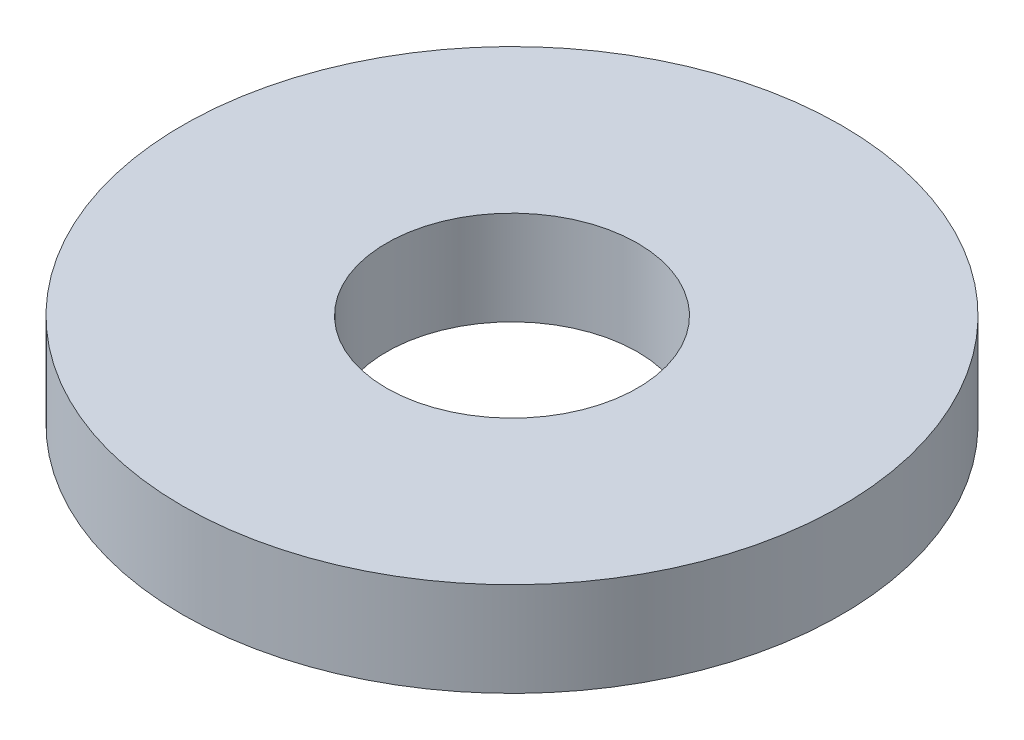
ISO-10303-21;
HEADER;
FILE_DESCRIPTION(('STEP AP214'),'2;1');
FILE_NAME('part.step','',(''),(''),'','','');
FILE_SCHEMA(('AUTOMOTIVE_DESIGN { 1 0 10303 214 1 1 1 1 }'));
ENDSEC;
DATA;
#1=APPLICATION_CONTEXT('core data for automotive mechanical design processes');
#2=APPLICATION_PROTOCOL_DEFINITION('international standard','automotive_design',2000,#1);
#3=PRODUCT_CONTEXT('',#1,'mechanical');
#4=PRODUCT('Part','Part','',(#3));
#5=PRODUCT_RELATED_PRODUCT_CATEGORY('part','',(#4));
#6=PRODUCT_DEFINITION_FORMATION('','',#4);
#7=PRODUCT_DEFINITION_CONTEXT('part definition',#1,'design');
#8=PRODUCT_DEFINITION('design','',#6,#7);
#9=PRODUCT_DEFINITION_SHAPE('','',#8);
#10=(LENGTH_UNIT() NAMED_UNIT(*) SI_UNIT(.MILLI.,.METRE.));
#11=(NAMED_UNIT(*) PLANE_ANGLE_UNIT() SI_UNIT($,.RADIAN.));
#12=(NAMED_UNIT(*) SI_UNIT($,.STERADIAN.) SOLID_ANGLE_UNIT());
#13=UNCERTAINTY_MEASURE_WITH_UNIT(LENGTH_MEASURE(1.E-05),#10,'distance_accuracy_value','');
#14=(GEOMETRIC_REPRESENTATION_CONTEXT(3) GLOBAL_UNCERTAINTY_ASSIGNED_CONTEXT((#13)) GLOBAL_UNIT_ASSIGNED_CONTEXT((#10,
#11,#12)) REPRESENTATION_CONTEXT('',''));
#15=CARTESIAN_POINT('',(0.,0.,0.));
#16=DIRECTION('',(0.,0.,1.));
#17=DIRECTION('',(1.,0.,0.));
#18=AXIS2_PLACEMENT_3D('',#15,#16,#17);
#19=CARTESIAN_POINT('',(0.,3.,0.));
#20=DIRECTION('',(0.,1.,0.));
#21=DIRECTION('',(0.,0.,-1.));
#22=AXIS2_PLACEMENT_3D('',#19,#20,#21);
#23=PLANE('',#22);
#24=CARTESIAN_POINT('',(0.,3.,0.));
#25=DIRECTION('',(0.,-1.,0.));
#26=DIRECTION('',(0.,0.,-1.));
#27=AXIS2_PLACEMENT_3D('',#24,#25,#26);
#28=CIRCLE('',#27,10.5);
#29=CARTESIAN_POINT('',(0.,3.,-10.5));
#30=VERTEX_POINT('',#29);
#31=EDGE_CURVE('E10',#30,#30,#28,.T.);
#32=ORIENTED_EDGE('',*,*,#31,.F.);
#33=EDGE_LOOP('',(#32));
#34=FACE_BOUND('',#33,.T.);
#35=CARTESIAN_POINT('',(0.,3.,0.));
#36=DIRECTION('',(0.,-1.,0.));
#37=DIRECTION('',(0.,0.,-1.));
#38=AXIS2_PLACEMENT_3D('',#35,#36,#37);
#39=CIRCLE('',#38,4.);
#40=CARTESIAN_POINT('',(0.,3.,-4.));
#41=VERTEX_POINT('',#40);
#42=EDGE_CURVE('E50',#41,#41,#39,.T.);
#43=ORIENTED_EDGE('',*,*,#42,.T.);
#44=EDGE_LOOP('',(#43));
#45=FACE_BOUND('',#44,.T.);
#46=ADVANCED_FACE('F39',(#34,#45),#23,.T.);
#47=CARTESIAN_POINT('',(0.,0.,0.));
#48=DIRECTION('',(0.,1.,0.));
#49=DIRECTION('',(0.,0.,-1.));
#50=AXIS2_PLACEMENT_3D('',#47,#48,#49);
#51=PLANE('',#50);
#52=CARTESIAN_POINT('',(0.,0.,0.));
#53=DIRECTION('',(0.,-1.,0.));
#54=DIRECTION('',(0.,0.,-1.));
#55=AXIS2_PLACEMENT_3D('',#52,#53,#54);
#56=CIRCLE('',#55,10.5);
#57=CARTESIAN_POINT('',(0.,0.,-10.5));
#58=VERTEX_POINT('',#57);
#59=EDGE_CURVE('E43',#58,#58,#56,.T.);
#60=ORIENTED_EDGE('',*,*,#59,.T.);
#61=EDGE_LOOP('',(#60));
#62=FACE_BOUND('',#61,.T.);
#63=CARTESIAN_POINT('',(0.,0.,0.));
#64=DIRECTION('',(0.,-1.,0.));
#65=DIRECTION('',(0.,0.,-1.));
#66=AXIS2_PLACEMENT_3D('',#63,#64,#65);
#67=CIRCLE('',#66,4.);
#68=CARTESIAN_POINT('',(0.,0.,-4.));
#69=VERTEX_POINT('',#68);
#70=EDGE_CURVE('E52',#69,#69,#67,.T.);
#71=ORIENTED_EDGE('',*,*,#70,.F.);
#72=EDGE_LOOP('',(#71));
#73=FACE_BOUND('',#72,.T.);
#74=ADVANCED_FACE('F65',(#62,#73),#51,.F.);
#75=CARTESIAN_POINT('',(0.,3.,0.));
#76=DIRECTION('',(0.,-1.,0.));
#77=DIRECTION('',(0.,0.,1.));
#78=AXIS2_PLACEMENT_3D('',#75,#76,#77);
#79=CYLINDRICAL_SURFACE('',#78,10.5);
#80=ORIENTED_EDGE('',*,*,#31,.T.);
#81=EDGE_LOOP('',(#80));
#82=FACE_BOUND('',#81,.T.);
#83=ORIENTED_EDGE('',*,*,#59,.F.);
#84=EDGE_LOOP('',(#83));
#85=FACE_BOUND('',#84,.T.);
#86=ADVANCED_FACE('F41',(#82,#85),#79,.T.);
#87=CARTESIAN_POINT('',(0.,3.,0.));
#88=DIRECTION('',(0.,-1.,0.));
#89=DIRECTION('',(0.,0.,1.));
#90=AXIS2_PLACEMENT_3D('',#87,#88,#89);
#91=CYLINDRICAL_SURFACE('',#90,4.);
#92=ORIENTED_EDGE('',*,*,#42,.F.);
#93=EDGE_LOOP('',(#92));
#94=FACE_BOUND('',#93,.T.);
#95=ORIENTED_EDGE('',*,*,#70,.T.);
#96=EDGE_LOOP('',(#95));
#97=FACE_BOUND('',#96,.T.);
#98=ADVANCED_FACE('F59',(#94,#97),#91,.F.);
#99=CLOSED_SHELL('',(#46,#74,#86,#98));
#100=MANIFOLD_SOLID_BREP('B2',#99);
#101=ADVANCED_BREP_SHAPE_REPRESENTATION('',(#18,#100),#14);
#102=SHAPE_DEFINITION_REPRESENTATION(#9,#101);
ENDSEC;
END-ISO-10303-21;
